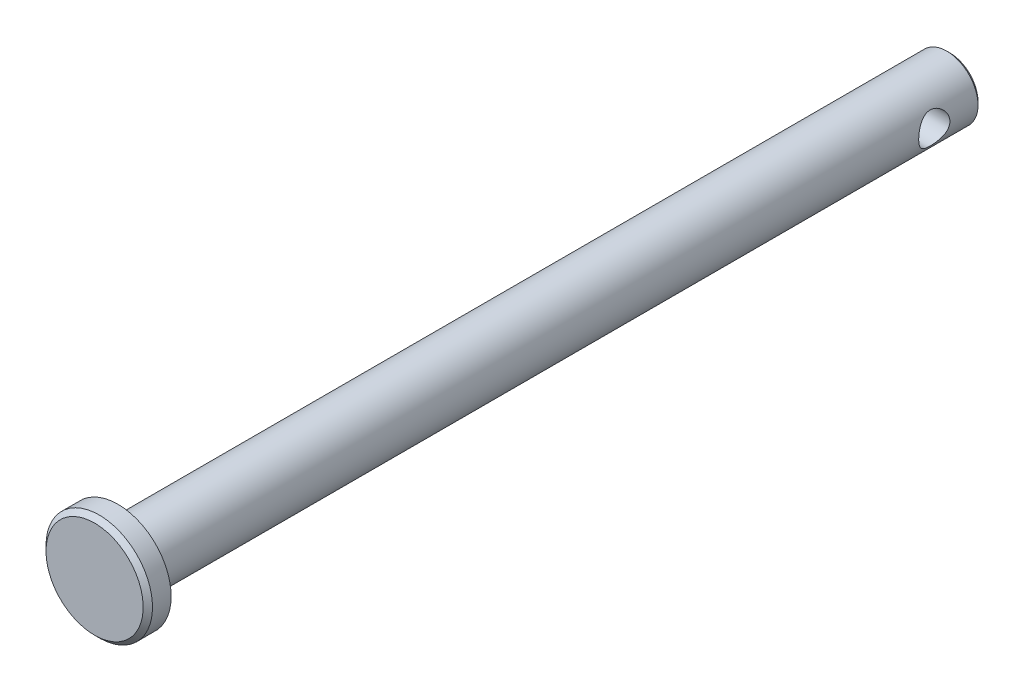
ISO-10303-21;
HEADER;
FILE_DESCRIPTION(('STEP AP214'),'2;1');
FILE_NAME('part.step','',(''),(''),'','','');
FILE_SCHEMA(('AUTOMOTIVE_DESIGN { 1 0 10303 214 1 1 1 1 }'));
ENDSEC;
DATA;
#1=APPLICATION_CONTEXT('core data for automotive mechanical design processes');
#2=APPLICATION_PROTOCOL_DEFINITION('international standard','automotive_design',2000,#1);
#3=PRODUCT_CONTEXT('',#1,'mechanical');
#4=PRODUCT('Part','Part','',(#3));
#5=PRODUCT_RELATED_PRODUCT_CATEGORY('part','',(#4));
#6=PRODUCT_DEFINITION_FORMATION('','',#4);
#7=PRODUCT_DEFINITION_CONTEXT('part definition',#1,'design');
#8=PRODUCT_DEFINITION('design','',#6,#7);
#9=PRODUCT_DEFINITION_SHAPE('','',#8);
#10=(LENGTH_UNIT() NAMED_UNIT(*) SI_UNIT(.MILLI.,.METRE.));
#11=(NAMED_UNIT(*) PLANE_ANGLE_UNIT() SI_UNIT($,.RADIAN.));
#12=(NAMED_UNIT(*) SI_UNIT($,.STERADIAN.) SOLID_ANGLE_UNIT());
#13=UNCERTAINTY_MEASURE_WITH_UNIT(LENGTH_MEASURE(1.E-05),#10,'distance_accuracy_value','');
#14=(GEOMETRIC_REPRESENTATION_CONTEXT(3) GLOBAL_UNCERTAINTY_ASSIGNED_CONTEXT((#13)) GLOBAL_UNIT_ASSIGNED_CONTEXT((#10,
#11,#12)) REPRESENTATION_CONTEXT('',''));
#15=CARTESIAN_POINT('',(0.,0.,0.));
#16=DIRECTION('',(0.,0.,1.));
#17=DIRECTION('',(1.,0.,0.));
#18=AXIS2_PLACEMENT_3D('',#15,#16,#17);
#19=CARTESIAN_POINT('',(0.,0.,31.75));
#20=DIRECTION('',(0.,0.,-1.));
#21=DIRECTION('',(-1.,0.,0.));
#22=AXIS2_PLACEMENT_3D('',#19,#20,#21);
#23=CYLINDRICAL_SURFACE('',#22,2.38125);
#24=CARTESIAN_POINT('',(0.,0.,-31.511875));
#25=DIRECTION('',(0.,0.,1.));
#26=DIRECTION('',(1.,0.,0.));
#27=AXIS2_PLACEMENT_3D('',#24,#25,#26);
#28=CIRCLE('',#27,2.38125);
#29=CARTESIAN_POINT('',(2.38125,0.,-31.511875));
#30=VERTEX_POINT('',#29);
#31=EDGE_CURVE('E37',#30,#30,#28,.T.);
#32=ORIENTED_EDGE('',*,*,#31,.T.);
#33=EDGE_LOOP('',(#32));
#34=FACE_BOUND('',#33,.T.);
#35=CARTESIAN_POINT('',(-2.38125,0.,-26.9875));
#36=CARTESIAN_POINT('',(-2.38124658771817,-0.0625934933908996,-26.9875039318241));
#37=CARTESIAN_POINT('',(-2.37875553370113,-0.12526160776547,-26.9924649933105));
#38=CARTESIAN_POINT('',(-2.36903604532025,-0.248745655116469,-27.0120898356559));
#39=CARTESIAN_POINT('',(-2.36179861446384,-0.309557840743266,-27.0267720429128));
#40=CARTESIAN_POINT('',(-2.34334382664568,-0.427355251873435,-27.0651213783844));
#41=CARTESIAN_POINT('',(-2.33214194770735,-0.484354349749462,-27.0887535887453));
#42=CARTESIAN_POINT('',(-2.30678565164099,-0.593493959385317,-27.1441512710626));
#43=CARTESIAN_POINT('',(-2.29263146732422,-0.645634853781904,-27.1759161017463));
#44=CARTESIAN_POINT('',(-2.26166669988499,-0.747126495522786,-27.2488627251684));
#45=CARTESIAN_POINT('',(-2.24474721461222,-0.796117610742266,-27.2904979643447));
#46=CARTESIAN_POINT('',(-2.2105140207503,-0.886753026544746,-27.3810271362285));
#47=CARTESIAN_POINT('',(-2.19320002298882,-0.928391728636495,-27.4299265485166));
#48=CARTESIAN_POINT('',(-2.15859063769341,-1.00637816303611,-27.5381442380263));
#49=CARTESIAN_POINT('',(-2.14140081986313,-1.04206516514117,-27.5979764170931));
#50=CARTESIAN_POINT('',(-2.11081118475794,-1.10271904514174,-27.7237436094086));
#51=CARTESIAN_POINT('',(-2.09740866244572,-1.12769358094429,-27.7896742220105));
#52=CARTESIAN_POINT('',(-2.07713897941891,-1.16458893898079,-27.921741891143));
#53=CARTESIAN_POINT('',(-2.06992860854359,-1.1772017235864,-27.9876303007427));
#54=CARTESIAN_POINT('',(-2.06194687719966,-1.19113338890835,-28.1209498037312));
#55=CARTESIAN_POINT('',(-2.06116915374352,-1.19246343021919,-28.1883793064747));
#56=CARTESIAN_POINT('',(-2.06586451337536,-1.18429955128952,-28.3141967977005));
#57=CARTESIAN_POINT('',(-2.07060121735085,-1.17608099119853,-28.3727017371749));
#58=CARTESIAN_POINT('',(-2.0845013483624,-1.15126275778341,-28.4873563983473));
#59=CARTESIAN_POINT('',(-2.09366618546584,-1.13466041470314,-28.5435053636291));
#60=CARTESIAN_POINT('',(-2.1155915160392,-1.09324351977209,-28.653457185961));
#61=CARTESIAN_POINT('',(-2.12843079040573,-1.06824668928498,-28.7071749310543));
#62=CARTESIAN_POINT('',(-2.15626240722546,-1.01089025937972,-28.809911454615));
#63=CARTESIAN_POINT('',(-2.17125571566414,-0.978527352789222,-28.8589281083239));
#64=CARTESIAN_POINT('',(-2.204003536286,-0.902572396630542,-28.9574143665474));
#65=CARTESIAN_POINT('',(-2.22186710625626,-0.858076839495928,-29.0061533401016));
#66=CARTESIAN_POINT('',(-2.25680138992047,-0.76147086093895,-29.0957818577598));
#67=CARTESIAN_POINT('',(-2.27387172175947,-0.709356821108761,-29.1366676505153));
#68=CARTESIAN_POINT('',(-2.30626428608779,-0.595927464756047,-29.2112132401635));
#69=CARTESIAN_POINT('',(-2.3214685301789,-0.534297244998049,-29.2444493125057));
#70=CARTESIAN_POINT('',(-2.34741102209979,-0.405367587816351,-29.2998092752043));
#71=CARTESIAN_POINT('',(-2.35815281492167,-0.338072701740846,-29.3219419890337));
#72=CARTESIAN_POINT('',(-2.37320534860897,-0.205700104133524,-29.3526472775502));
#73=CARTESIAN_POINT('',(-2.37797504664999,-0.1409003848091,-29.362191127561));
#74=CARTESIAN_POINT('',(-2.38211931649743,-0.0104532111897005,-29.370493945507));
#75=CARTESIAN_POINT('',(-2.38149644415063,0.0551938267826002,-29.3692580225895));
#76=CARTESIAN_POINT('',(-2.37519200776753,0.180061757270823,-29.3565976616014));
#77=CARTESIAN_POINT('',(-2.36990626897501,0.239386357709476,-29.3459703282183));
#78=CARTESIAN_POINT('',(-2.35532022721706,0.35529070614697,-29.3160790456499));
#79=CARTESIAN_POINT('',(-2.34601948166815,0.411870150775843,-29.2968141443165));
#80=CARTESIAN_POINT('',(-2.323912493394,0.522551749435383,-29.249689325903));
#81=CARTESIAN_POINT('',(-2.31101362357334,0.576536816435452,-29.2215994059547));
#82=CARTESIAN_POINT('',(-2.28295169421308,0.679205558772778,-29.1578813403714));
#83=CARTESIAN_POINT('',(-2.26778767095513,0.727886962326196,-29.1222499834997));
#84=CARTESIAN_POINT('',(-2.23490101029919,0.823635905061685,-29.040422743588));
#85=CARTESIAN_POINT('',(-2.21707334772675,0.870075505159961,-28.9935330222475));
#86=CARTESIAN_POINT('',(-2.18196785003363,0.954710182325452,-28.89258911677));
#87=CARTESIAN_POINT('',(-2.1646904022613,0.992899556088159,-28.8385300179093));
#88=CARTESIAN_POINT('',(-2.13182825744162,1.06168973569882,-28.7214742742178));
#89=CARTESIAN_POINT('',(-2.11636605630571,1.09183348103051,-28.6581715861704));
#90=CARTESIAN_POINT('',(-2.090428799133,1.14071736472269,-28.5263708256536));
#91=CARTESIAN_POINT('',(-2.07994732092736,1.15947219672864,-28.4578795762595));
#92=CARTESIAN_POINT('',(-2.06646662138444,1.18331657161978,-28.3246787659056));
#93=CARTESIAN_POINT('',(-2.06284572182647,1.18954509883978,-28.2602373420111));
#94=CARTESIAN_POINT('',(-2.06175000375602,1.19144552443463,-28.1311583356499));
#95=CARTESIAN_POINT('',(-2.06427252119055,1.18712199863718,-28.0665208503446));
#96=CARTESIAN_POINT('',(-2.0745195450331,1.16910579328329,-27.9453774559884));
#97=CARTESIAN_POINT('',(-2.081725593681,1.1563448992644,-27.8886835027343));
#98=CARTESIAN_POINT('',(-2.09991741148739,1.12296816088622,-27.77830345781));
#99=CARTESIAN_POINT('',(-2.11090439637645,1.10234978978715,-27.7246183400717));
#100=CARTESIAN_POINT('',(-2.13632093965266,1.05229312174863,-27.6177872867941));
#101=CARTESIAN_POINT('',(-2.15093219477964,1.02235532346272,-27.564919904384));
#102=CARTESIAN_POINT('',(-2.18164566727434,0.955061000604872,-27.46461375536));
#103=CARTESIAN_POINT('',(-2.19774865799103,0.91770061638102,-27.4171778333514));
#104=CARTESIAN_POINT('',(-2.23197328511557,0.831298335810093,-27.3230872022555));
#105=CARTESIAN_POINT('',(-2.25010245755217,0.78138864114649,-27.2772277562503));
#106=CARTESIAN_POINT('',(-2.28454448778714,0.674078066156025,-27.1943556353612));
#107=CARTESIAN_POINT('',(-2.30085636405197,0.616673173627614,-27.1573477289956));
#108=CARTESIAN_POINT('',(-2.33002942662263,0.495218557463753,-27.0931842055862));
#109=CARTESIAN_POINT('',(-2.34286539970213,0.431124721872154,-27.0661000982945));
#110=CARTESIAN_POINT('',(-2.36340659560876,0.298539814353401,-27.0234471500715));
#111=CARTESIAN_POINT('',(-2.37112639390897,0.230061848926336,-27.0078455823685));
#112=CARTESIAN_POINT('',(-2.37762409336193,0.134066692531782,-26.9947658949378));
#113=CARTESIAN_POINT('',(-2.37898025606987,0.107348987707656,-26.9920450432217));
#114=CARTESIAN_POINT('',(-2.3807939546427,0.0537587806828983,-26.988411226369));
#115=CARTESIAN_POINT('',(-2.38125146570418,0.0268862742301641,-26.9874983111327));
#116=CARTESIAN_POINT('',(-2.38125,0.,-26.9875));
#117=B_SPLINE_CURVE_WITH_KNOTS('',3,(#35,#36,#37,#38,#39,#40,#41,#42,#43,#44,#45,#46,#47,#48,
#49,#50,#51,#52,#53,#54,#55,#56,#57,#58,#59,#60,#61,#62,#63,#64,#65,#66,#67,#68,#69,#70,#71,#72,
#73,#74,#75,#76,#77,#78,#79,#80,#81,#82,#83,#84,#85,#86,#87,#88,#89,#90,#91,#92,#93,#94,#95,#96,
#97,#98,#99,#100,#101,#102,#103,#104,#105,#106,#107,#108,#109,#110,#111,#112,#113,#114,#115,
#116),.UNSPECIFIED.,.T.,.F.,(4,2,2,2,2,2,2,2,2,2,2,2,2,2,2,2,2,2,2,2,2,2,2,2,2,2,2,2,2,2,2,2,2,
2,2,2,2,2,2,2,4),(0.,0.187671381491036,0.375699515747514,0.563001503883019,0.75028872744243,
0.948906406473726,1.14767467670684,1.36185743031615,1.57588681716391,1.77710320704461,
1.97812053569865,2.15509926337348,2.33213438424011,2.51329317200606,2.69453345625452,
2.8987544577565,3.10307277131562,3.31687910824069,3.53051527011184,3.72645730217447,
3.92230647121477,4.10297598058852,4.28366541066829,4.46952119208218,4.65545627297242,
4.85965036423512,5.0639851644525,5.27821543446363,5.4921687202949,5.68558331740252,
5.8789140564582,6.05382723196982,6.22879670208068,6.41552156348467,6.60234377481073,
6.81186617152195,7.02150118957733,7.23261841267422,7.44313156831559,7.52374130413948,
7.60435326481741),.UNSPECIFIED.);
#118=CARTESIAN_POINT('',(-2.38125,0.,-26.9875));
#119=VERTEX_POINT('',#118);
#120=EDGE_CURVE('E48',#119,#119,#117,.T.);
#121=ORIENTED_EDGE('',*,*,#120,.T.);
#122=EDGE_LOOP('',(#121));
#123=FACE_BOUND('',#122,.T.);
#124=CARTESIAN_POINT('',(2.38125,0.,-29.36875));
#125=CARTESIAN_POINT('',(2.38124658771817,-0.0625934933908996,-29.3687460681758));
#126=CARTESIAN_POINT('',(2.37875553370113,-0.12526160776547,-29.3637850066895));
#127=CARTESIAN_POINT('',(2.36903604532025,-0.248745655116469,-29.3441601643441));
#128=CARTESIAN_POINT('',(2.36179861446384,-0.309557840743266,-29.3294779570872));
#129=CARTESIAN_POINT('',(2.34334382664568,-0.427355251873434,-29.2911286216156));
#130=CARTESIAN_POINT('',(2.33214194770735,-0.484354349749461,-29.2674964112547));
#131=CARTESIAN_POINT('',(2.30678565164099,-0.593493959385316,-29.2120987289374));
#132=CARTESIAN_POINT('',(2.29263146732422,-0.645634853781903,-29.1803338982537));
#133=CARTESIAN_POINT('',(2.26166669988499,-0.747126495522786,-29.1073872748316));
#134=CARTESIAN_POINT('',(2.24474721461222,-0.796117610742266,-29.0657520356553));
#135=CARTESIAN_POINT('',(2.2105140207503,-0.886753026544746,-28.9752228637715));
#136=CARTESIAN_POINT('',(2.19320002298882,-0.928391728636495,-28.9263234514834));
#137=CARTESIAN_POINT('',(2.15859063769341,-1.00637816303611,-28.8181057619737));
#138=CARTESIAN_POINT('',(2.14140081986313,-1.04206516514117,-28.7582735829069));
#139=CARTESIAN_POINT('',(2.11081118475794,-1.10271904514174,-28.6325063905914));
#140=CARTESIAN_POINT('',(2.09740866244572,-1.12769358094429,-28.5665757779895));
#141=CARTESIAN_POINT('',(2.07713897941891,-1.16458893898079,-28.434508108857));
#142=CARTESIAN_POINT('',(2.06992860854359,-1.1772017235864,-28.3686196992573));
#143=CARTESIAN_POINT('',(2.06194687719966,-1.19113338890835,-28.2353001962688));
#144=CARTESIAN_POINT('',(2.06116915374352,-1.19246343021919,-28.1678706935253));
#145=CARTESIAN_POINT('',(2.06586451337536,-1.18429955128952,-28.0420532022995));
#146=CARTESIAN_POINT('',(2.07060121735085,-1.17608099119853,-27.9835482628251));
#147=CARTESIAN_POINT('',(2.0845013483624,-1.15126275778341,-27.8688936016527));
#148=CARTESIAN_POINT('',(2.09366618546583,-1.13466041470314,-27.8127446363709));
#149=CARTESIAN_POINT('',(2.1155915160392,-1.09324351977209,-27.702792814039));
#150=CARTESIAN_POINT('',(2.12843079040573,-1.06824668928498,-27.6490750689457));
#151=CARTESIAN_POINT('',(2.15626240722546,-1.01089025937972,-27.546338545385));
#152=CARTESIAN_POINT('',(2.17125571566414,-0.978527352789223,-27.4973218916761));
#153=CARTESIAN_POINT('',(2.204003536286,-0.902572396630542,-27.3988356334526));
#154=CARTESIAN_POINT('',(2.22186710625626,-0.858076839495928,-27.3500966598984));
#155=CARTESIAN_POINT('',(2.25680138992047,-0.76147086093895,-27.2604681422402));
#156=CARTESIAN_POINT('',(2.27387172175947,-0.709356821108761,-27.2195823494847));
#157=CARTESIAN_POINT('',(2.30626428608779,-0.595927464756047,-27.1450367598365));
#158=CARTESIAN_POINT('',(2.3214685301789,-0.534297244998049,-27.1118006874943));
#159=CARTESIAN_POINT('',(2.34741102209979,-0.405367587816351,-27.0564407247957));
#160=CARTESIAN_POINT('',(2.35815281492167,-0.338072701740846,-27.0343080109663));
#161=CARTESIAN_POINT('',(2.37320534860897,-0.205700104133524,-27.0036027224498));
#162=CARTESIAN_POINT('',(2.37797504664999,-0.1409003848091,-26.994058872439));
#163=CARTESIAN_POINT('',(2.38211931649743,-0.0104532111897004,-26.985756054493));
#164=CARTESIAN_POINT('',(2.38149644415063,0.0551938267826003,-26.9869919774105));
#165=CARTESIAN_POINT('',(2.37519200776753,0.180061757270823,-26.9996523383986));
#166=CARTESIAN_POINT('',(2.36990626897501,0.239386357709476,-27.0102796717817));
#167=CARTESIAN_POINT('',(2.35532022721706,0.35529070614697,-27.0401709543501));
#168=CARTESIAN_POINT('',(2.34601948166815,0.411870150775843,-27.0594358556835));
#169=CARTESIAN_POINT('',(2.323912493394,0.522551749435382,-27.106560674097));
#170=CARTESIAN_POINT('',(2.31101362357334,0.57653681643545,-27.1346505940453));
#171=CARTESIAN_POINT('',(2.28295169421308,0.679205558772777,-27.1983686596286));
#172=CARTESIAN_POINT('',(2.26778767095513,0.727886962326195,-27.2340000165003));
#173=CARTESIAN_POINT('',(2.23490101029919,0.823635905061684,-27.3158272564119));
#174=CARTESIAN_POINT('',(2.21707334772675,0.87007550515996,-27.3627169777525));
#175=CARTESIAN_POINT('',(2.18196785003363,0.954710182325451,-27.46366088323));
#176=CARTESIAN_POINT('',(2.1646904022613,0.992899556088159,-27.5177199820907));
#177=CARTESIAN_POINT('',(2.13182825744162,1.06168973569882,-27.6347757257822));
#178=CARTESIAN_POINT('',(2.11636605630571,1.0918334810305,-27.6980784138296));
#179=CARTESIAN_POINT('',(2.090428799133,1.14071736472269,-27.8298791743464));
#180=CARTESIAN_POINT('',(2.07994732092736,1.15947219672864,-27.8983704237405));
#181=CARTESIAN_POINT('',(2.06646662138444,1.18331657161978,-28.0315712340944));
#182=CARTESIAN_POINT('',(2.06284572182647,1.18954509883978,-28.0960126579889));
#183=CARTESIAN_POINT('',(2.06175000375602,1.19144552443463,-28.2250916643501));
#184=CARTESIAN_POINT('',(2.06427252119055,1.18712199863718,-28.2897291496554));
#185=CARTESIAN_POINT('',(2.0745195450331,1.16910579328329,-28.4108725440115));
#186=CARTESIAN_POINT('',(2.081725593681,1.1563448992644,-28.4675664972657));
#187=CARTESIAN_POINT('',(2.09991741148739,1.12296816088622,-28.57794654219));
#188=CARTESIAN_POINT('',(2.11090439637645,1.10234978978715,-28.6316316599282));
#189=CARTESIAN_POINT('',(2.13632093965266,1.05229312174863,-28.7384627132059));
#190=CARTESIAN_POINT('',(2.15093219477964,1.02235532346272,-28.791330095616));
#191=CARTESIAN_POINT('',(2.18164566727434,0.955061000604872,-28.89163624464));
#192=CARTESIAN_POINT('',(2.19774865799103,0.91770061638102,-28.9390721666486));
#193=CARTESIAN_POINT('',(2.23197328511557,0.831298335810093,-29.0331627977445));
#194=CARTESIAN_POINT('',(2.25010245755217,0.78138864114649,-29.0790222437497));
#195=CARTESIAN_POINT('',(2.28454448778714,0.674078066156025,-29.1618943646388));
#196=CARTESIAN_POINT('',(2.30085636405197,0.616673173627614,-29.1989022710044));
#197=CARTESIAN_POINT('',(2.33002942662263,0.495218557463753,-29.2630657944137));
#198=CARTESIAN_POINT('',(2.34286539970213,0.431124721872154,-29.2901499017055));
#199=CARTESIAN_POINT('',(2.36340659560876,0.298539814353401,-29.3328028499285));
#200=CARTESIAN_POINT('',(2.37112639390897,0.230061848926336,-29.3484044176315));
#201=CARTESIAN_POINT('',(2.37762409336193,0.134066692531782,-29.3614841050622));
#202=CARTESIAN_POINT('',(2.37898025606987,0.107348987707656,-29.3642049567782));
#203=CARTESIAN_POINT('',(2.3807939546427,0.0537587806828983,-29.3678387736309));
#204=CARTESIAN_POINT('',(2.38125146570418,0.0268862742301641,-29.3687516888673));
#205=CARTESIAN_POINT('',(2.38125,0.,-29.36875));
#206=B_SPLINE_CURVE_WITH_KNOTS('',3,(#124,#125,#126,#127,#128,#129,#130,#131,#132,#133,#134,
#135,#136,#137,#138,#139,#140,#141,#142,#143,#144,#145,#146,#147,#148,#149,#150,#151,#152,#153,
#154,#155,#156,#157,#158,#159,#160,#161,#162,#163,#164,#165,#166,#167,#168,#169,#170,#171,#172,
#173,#174,#175,#176,#177,#178,#179,#180,#181,#182,#183,#184,#185,#186,#187,#188,#189,#190,#191,
#192,#193,#194,#195,#196,#197,#198,#199,#200,#201,#202,#203,#204,#205),.UNSPECIFIED.,.T.,.F.,(4,
2,2,2,2,2,2,2,2,2,2,2,2,2,2,2,2,2,2,2,2,2,2,2,2,2,2,2,2,2,2,2,2,2,2,2,2,2,2,2,4),(0.,
0.187671381491036,0.375699515747514,0.563001503883017,0.750288727442429,0.948906406473726,
1.14767467670684,1.36185743031615,1.57588681716391,1.77710320704461,1.97812053569865,
2.15509926337347,2.33213438424011,2.51329317200606,2.69453345625452,2.8987544577565,
3.10307277131562,3.31687910824069,3.53051527011184,3.72645730217447,3.92230647121477,
4.10297598058852,4.28366541066829,4.46952119208218,4.65545627297242,4.85965036423512,
5.0639851644525,5.27821543446363,5.4921687202949,5.68558331740252,5.8789140564582,
6.05382723196982,6.22879670208068,6.41552156348467,6.60234377481073,6.81186617152195,
7.02150118957733,7.23261841267422,7.44313156831559,7.52374130413948,7.60435326481741),.UNSPECIFIED.);
#207=CARTESIAN_POINT('',(2.38125,0.,-29.36875));
#208=VERTEX_POINT('',#207);
#209=EDGE_CURVE('E56',#208,#208,#206,.T.);
#210=ORIENTED_EDGE('',*,*,#209,.T.);
#211=EDGE_LOOP('',(#210));
#212=FACE_BOUND('',#211,.T.);
#213=CARTESIAN_POINT('',(0.,0.,31.75));
#214=DIRECTION('',(0.,0.,1.));
#215=DIRECTION('',(1.,0.,0.));
#216=AXIS2_PLACEMENT_3D('',#213,#214,#215);
#217=CIRCLE('',#216,2.38125);
#218=CARTESIAN_POINT('',(2.38125,0.,31.75));
#219=VERTEX_POINT('',#218);
#220=EDGE_CURVE('E94',#219,#219,#217,.T.);
#221=ORIENTED_EDGE('',*,*,#220,.F.);
#222=EDGE_LOOP('',(#221));
#223=FACE_BOUND('',#222,.T.);
#224=ADVANCED_FACE('F30',(#34,#123,#212,#223),#23,.T.);
#225=CARTESIAN_POINT('',(0.,0.,-31.75));
#226=DIRECTION('',(0.,0.,1.));
#227=DIRECTION('',(1.,0.,0.));
#228=AXIS2_PLACEMENT_3D('',#225,#226,#227);
#229=PLANE('',#228);
#230=CARTESIAN_POINT('',(0.,0.,-31.75));
#231=DIRECTION('',(0.,0.,1.));
#232=DIRECTION('',(1.,0.,0.));
#233=AXIS2_PLACEMENT_3D('',#230,#231,#232);
#234=CIRCLE('',#233,2.143125);
#235=CARTESIAN_POINT('',(2.14312499999999,0.,-31.75));
#236=VERTEX_POINT('',#235);
#237=EDGE_CURVE('E10',#236,#236,#234,.F.);
#238=ORIENTED_EDGE('',*,*,#237,.T.);
#239=EDGE_LOOP('',(#238));
#240=FACE_BOUND('',#239,.T.);
#241=ADVANCED_FACE('F76',(#240),#229,.F.);
#242=CARTESIAN_POINT('',(0.,0.,31.75));
#243=DIRECTION('',(0.,0.,1.));
#244=DIRECTION('',(1.,0.,0.));
#245=AXIS2_PLACEMENT_3D('',#242,#243,#244);
#246=PLANE('',#245);
#247=CARTESIAN_POINT('',(0.,0.,31.75));
#248=DIRECTION('',(0.,0.,1.));
#249=DIRECTION('',(1.,0.,0.));
#250=AXIS2_PLACEMENT_3D('',#247,#248,#249);
#251=CIRCLE('',#250,4.064);
#252=CARTESIAN_POINT('',(4.064,0.,31.75));
#253=VERTEX_POINT('',#252);
#254=EDGE_CURVE('E55',#253,#253,#251,.T.);
#255=ORIENTED_EDGE('',*,*,#254,.F.);
#256=EDGE_LOOP('',(#255));
#257=FACE_BOUND('',#256,.T.);
#258=ORIENTED_EDGE('',*,*,#220,.T.);
#259=EDGE_LOOP('',(#258));
#260=FACE_BOUND('',#259,.T.);
#261=ADVANCED_FACE('F73',(#257,#260),#246,.F.);
#262=CARTESIAN_POINT('',(0.,0.,33.528));
#263=DIRECTION('',(0.,0.,-1.));
#264=DIRECTION('',(-1.,0.,0.));
#265=AXIS2_PLACEMENT_3D('',#262,#263,#264);
#266=CYLINDRICAL_SURFACE('',#265,4.064);
#267=CARTESIAN_POINT('',(0.,0.,33.1724));
#268=DIRECTION('',(0.,0.,1.));
#269=DIRECTION('',(1.,0.,0.));
#270=AXIS2_PLACEMENT_3D('',#267,#268,#269);
#271=CIRCLE('',#270,4.064);
#272=CARTESIAN_POINT('',(-4.064,0.,33.1724));
#273=VERTEX_POINT('',#272);
#274=EDGE_CURVE('E41',#273,#273,#271,.F.);
#275=ORIENTED_EDGE('',*,*,#274,.T.);
#276=EDGE_LOOP('',(#275));
#277=FACE_BOUND('',#276,.T.);
#278=ORIENTED_EDGE('',*,*,#254,.T.);
#279=EDGE_LOOP('',(#278));
#280=FACE_BOUND('',#279,.T.);
#281=ADVANCED_FACE('F71',(#277,#280),#266,.T.);
#282=CARTESIAN_POINT('',(0.,0.,33.528));
#283=DIRECTION('',(0.,0.,1.));
#284=DIRECTION('',(1.,0.,0.));
#285=AXIS2_PLACEMENT_3D('',#282,#283,#284);
#286=PLANE('',#285);
#287=CARTESIAN_POINT('',(0.,0.,33.528));
#288=DIRECTION('',(0.,0.,1.));
#289=DIRECTION('',(1.,0.,0.));
#290=AXIS2_PLACEMENT_3D('',#287,#288,#289);
#291=CIRCLE('',#290,3.70840000000001);
#292=CARTESIAN_POINT('',(-3.70840000000002,0.,33.528));
#293=VERTEX_POINT('',#292);
#294=EDGE_CURVE('E45',#293,#293,#291,.T.);
#295=ORIENTED_EDGE('',*,*,#294,.T.);
#296=EDGE_LOOP('',(#295));
#297=FACE_BOUND('',#296,.T.);
#298=ADVANCED_FACE('F67',(#297),#286,.T.);
#299=CARTESIAN_POINT('',(0.,0.,33.528));
#300=DIRECTION('',(0.,0.,-1.));
#301=DIRECTION('',(-1.,0.,0.));
#302=AXIS2_PLACEMENT_3D('',#299,#300,#301);
#303=CONICAL_SURFACE('',#302,3.70840000000001,0.785398163397451);
#304=CARTESIAN_POINT('',(-4.064,0.,33.1724));
#305=CARTESIAN_POINT('',(-4.06029583333334,0.,33.1761041666667));
#306=CARTESIAN_POINT('',(-4.05659166666667,0.,33.1798083333333));
#307=CARTESIAN_POINT('',(-4.04918333333334,0.,33.1872166666667));
#308=CARTESIAN_POINT('',(-4.04547916666667,0.,33.1909208333333));
#309=CARTESIAN_POINT('',(-4.03807083333334,0.,33.1983291666667));
#310=CARTESIAN_POINT('',(-4.03436666666667,0.,33.2020333333333));
#311=CARTESIAN_POINT('',(-4.02695833333334,0.,33.2094416666667));
#312=CARTESIAN_POINT('',(-4.02325416666667,0.,33.2131458333333));
#313=CARTESIAN_POINT('',(-4.01584583333334,0.,33.2205541666667));
#314=CARTESIAN_POINT('',(-4.01214166666667,0.,33.2242583333333));
#315=CARTESIAN_POINT('',(-4.00473333333334,0.,33.2316666666667));
#316=CARTESIAN_POINT('',(-4.00102916666667,0.,33.2353708333333));
#317=CARTESIAN_POINT('',(-3.99362083333334,0.,33.2427791666667));
#318=CARTESIAN_POINT('',(-3.98991666666667,0.,33.2464833333333));
#319=CARTESIAN_POINT('',(-3.98250833333334,0.,33.2538916666667));
#320=CARTESIAN_POINT('',(-3.97880416666667,0.,33.2575958333333));
#321=CARTESIAN_POINT('',(-3.97139583333334,0.,33.2650041666667));
#322=CARTESIAN_POINT('',(-3.96769166666667,0.,33.2687083333333));
#323=CARTESIAN_POINT('',(-3.96028333333334,0.,33.2761166666667));
#324=CARTESIAN_POINT('',(-3.95657916666668,0.,33.2798208333333));
#325=CARTESIAN_POINT('',(-3.94917083333334,0.,33.2872291666667));
#326=CARTESIAN_POINT('',(-3.94546666666667,0.,33.2909333333333));
#327=CARTESIAN_POINT('',(-3.93805833333334,0.,33.2983416666667));
#328=CARTESIAN_POINT('',(-3.93435416666668,0.,33.3020458333333));
#329=CARTESIAN_POINT('',(-3.92694583333334,0.,33.3094541666667));
#330=CARTESIAN_POINT('',(-3.92324166666668,0.,33.3131583333333));
#331=CARTESIAN_POINT('',(-3.91583333333334,0.,33.3205666666667));
#332=CARTESIAN_POINT('',(-3.91212916666668,0.,33.3242708333333));
#333=CARTESIAN_POINT('',(-3.90472083333334,0.,33.3316791666667));
#334=CARTESIAN_POINT('',(-3.90101666666668,0.,33.3353833333333));
#335=CARTESIAN_POINT('',(-3.89360833333334,0.,33.3427916666667));
#336=CARTESIAN_POINT('',(-3.88990416666668,0.,33.3464958333333));
#337=CARTESIAN_POINT('',(-3.88249583333334,0.,33.3539041666667));
#338=CARTESIAN_POINT('',(-3.87879166666668,0.,33.3576083333333));
#339=CARTESIAN_POINT('',(-3.87138333333334,0.,33.3650166666667));
#340=CARTESIAN_POINT('',(-3.86767916666668,0.,33.3687208333333));
#341=CARTESIAN_POINT('',(-3.86027083333335,0.,33.3761291666667));
#342=CARTESIAN_POINT('',(-3.85656666666668,0.,33.3798333333333));
#343=CARTESIAN_POINT('',(-3.84915833333335,0.,33.3872416666667));
#344=CARTESIAN_POINT('',(-3.84545416666668,0.,33.3909458333333));
#345=CARTESIAN_POINT('',(-3.83804583333335,0.,33.3983541666667));
#346=CARTESIAN_POINT('',(-3.83434166666668,0.,33.4020583333333));
#347=CARTESIAN_POINT('',(-3.82693333333335,0.,33.4094666666667));
#348=CARTESIAN_POINT('',(-3.82322916666668,0.,33.4131708333333));
#349=CARTESIAN_POINT('',(-3.81582083333335,0.,33.4205791666667));
#350=CARTESIAN_POINT('',(-3.81211666666668,0.,33.4242833333333));
#351=CARTESIAN_POINT('',(-3.80470833333335,0.,33.4316916666667));
#352=CARTESIAN_POINT('',(-3.80100416666668,0.,33.4353958333333));
#353=CARTESIAN_POINT('',(-3.79359583333335,0.,33.4428041666667));
#354=CARTESIAN_POINT('',(-3.78989166666668,0.,33.4465083333333));
#355=CARTESIAN_POINT('',(-3.78248333333335,0.,33.4539166666667));
#356=CARTESIAN_POINT('',(-3.77877916666668,0.,33.4576208333333));
#357=CARTESIAN_POINT('',(-3.77137083333335,0.,33.4650291666667));
#358=CARTESIAN_POINT('',(-3.76766666666668,0.,33.4687333333333));
#359=CARTESIAN_POINT('',(-3.76025833333335,0.,33.4761416666667));
#360=CARTESIAN_POINT('',(-3.75655416666668,0.,33.4798458333333));
#361=CARTESIAN_POINT('',(-3.74914583333335,0.,33.4872541666667));
#362=CARTESIAN_POINT('',(-3.74544166666668,0.,33.4909583333333));
#363=CARTESIAN_POINT('',(-3.73803333333335,0.,33.4983666666667));
#364=CARTESIAN_POINT('',(-3.73432916666668,0.,33.5020708333333));
#365=CARTESIAN_POINT('',(-3.72692083333335,0.,33.5094791666667));
#366=CARTESIAN_POINT('',(-3.72321666666668,0.,33.5131833333333));
#367=CARTESIAN_POINT('',(-3.71580833333335,0.,33.5205916666667));
#368=CARTESIAN_POINT('',(-3.71210416666668,0.,33.5242958333333));
#369=CARTESIAN_POINT('',(-3.70840000000002,0.,33.528));
#370=B_SPLINE_CURVE_WITH_KNOTS('',3,(#304,#305,#306,#307,#308,#309,#310,#311,#312,#313,#314,
#315,#316,#317,#318,#319,#320,#321,#322,#323,#324,#325,#326,#327,#328,#329,#330,#331,#332,#333,
#334,#335,#336,#337,#338,#339,#340,#341,#342,#343,#344,#345,#346,#347,#348,#349,#350,#351,#352,
#353,#354,#355,#356,#357,#358,#359,#360,#361,#362,#363,#364,#365,#366,#367,#368,#369),
.UNSPECIFIED.,.F.,.F.,(4,2,2,2,2,2,2,2,2,2,2,2,2,2,2,2,2,2,2,2,2,2,2,2,2,2,2,2,2,2,2,2,4),(0.,
0.0157154482118709,0.0314308964237418,0.0471463446356127,0.0628617928474837,0.0785772410593546,
0.0942926892712255,0.110008137483096,0.125723585694962,0.141439033906833,0.157154482118704,
0.172869930330576,0.188585378542447,0.204300826754318,0.220016274966188,0.235731723178059,
0.251447171389925,0.267162619601796,0.282878067813667,0.298593516025538,0.314308964237409,
0.33002441244928,0.345739860661151,0.361455308873022,0.377170757084893,0.392886205296759,
0.40860165350863,0.424317101720501,0.440032549932372,0.455747998144243,0.471463446356114,
0.487178894567985,0.502894342779856),.UNSPECIFIED.);
#371=EDGE_CURVE('BSEAM65',#273,#293,#370,.T.);
#372=ORIENTED_EDGE('',*,*,#274,.F.);
#373=ORIENTED_EDGE('',*,*,#294,.F.);
#374=ORIENTED_EDGE('',*,*,#371,.T.);
#375=ORIENTED_EDGE('',*,*,#371,.F.);
#376=EDGE_LOOP('',(#372,#374,#373,#375));
#377=FACE_BOUND('',#376,.T.);
#378=ADVANCED_FACE('F65',(#377),#303,.T.);
#379=CARTESIAN_POINT('',(-4.064,0.,-28.178125));
#380=DIRECTION('',(1.,0.,0.));
#381=DIRECTION('',(0.,0.,-1.));
#382=AXIS2_PLACEMENT_3D('',#379,#380,#381);
#383=CYLINDRICAL_SURFACE('',#382,1.190625);
#384=ORIENTED_EDGE('',*,*,#209,.F.);
#385=EDGE_LOOP('',(#384));
#386=FACE_BOUND('',#385,.T.);
#387=ORIENTED_EDGE('',*,*,#120,.F.);
#388=EDGE_LOOP('',(#387));
#389=FACE_BOUND('',#388,.T.);
#390=ADVANCED_FACE('F61',(#386,#389),#383,.F.);
#391=CARTESIAN_POINT('',(0.,0.,-31.511875));
#392=DIRECTION('',(0.,0.,1.));
#393=DIRECTION('',(1.,0.,0.));
#394=AXIS2_PLACEMENT_3D('',#391,#392,#393);
#395=CONICAL_SURFACE('',#394,2.38125,0.785398163397446);
#396=CARTESIAN_POINT('',(2.14312499999999,0.,-31.75));
#397=CARTESIAN_POINT('',(2.14560546874999,0.,-31.74751953125));
#398=CARTESIAN_POINT('',(2.14808593749999,0.,-31.7450390625));
#399=CARTESIAN_POINT('',(2.15304687499999,0.,-31.740078125));
#400=CARTESIAN_POINT('',(2.15552734374999,0.,-31.73759765625));
#401=CARTESIAN_POINT('',(2.16048828124999,0.,-31.73263671875));
#402=CARTESIAN_POINT('',(2.16296874999999,0.,-31.73015625));
#403=CARTESIAN_POINT('',(2.16792968749999,0.,-31.7251953125));
#404=CARTESIAN_POINT('',(2.17041015624999,0.,-31.72271484375));
#405=CARTESIAN_POINT('',(2.17537109374999,0.,-31.71775390625));
#406=CARTESIAN_POINT('',(2.17785156249999,0.,-31.7152734375));
#407=CARTESIAN_POINT('',(2.18281249999999,0.,-31.7103125));
#408=CARTESIAN_POINT('',(2.18529296874999,0.,-31.70783203125));
#409=CARTESIAN_POINT('',(2.19025390624999,0.,-31.70287109375));
#410=CARTESIAN_POINT('',(2.19273437499999,0.,-31.700390625));
#411=CARTESIAN_POINT('',(2.19769531249999,0.,-31.6954296875));
#412=CARTESIAN_POINT('',(2.20017578124999,0.,-31.69294921875));
#413=CARTESIAN_POINT('',(2.20513671874999,0.,-31.68798828125));
#414=CARTESIAN_POINT('',(2.20761718749999,0.,-31.6855078125));
#415=CARTESIAN_POINT('',(2.21257812499999,0.,-31.680546875));
#416=CARTESIAN_POINT('',(2.21505859374999,0.,-31.67806640625));
#417=CARTESIAN_POINT('',(2.22001953124999,0.,-31.67310546875));
#418=CARTESIAN_POINT('',(2.22249999999999,0.,-31.670625));
#419=CARTESIAN_POINT('',(2.22746093749999,0.,-31.6656640625));
#420=CARTESIAN_POINT('',(2.22994140624999,0.,-31.66318359375));
#421=CARTESIAN_POINT('',(2.23490234374999,0.,-31.65822265625));
#422=CARTESIAN_POINT('',(2.23738281249999,0.,-31.6557421875));
#423=CARTESIAN_POINT('',(2.24234374999999,0.,-31.65078125));
#424=CARTESIAN_POINT('',(2.24482421874999,0.,-31.64830078125));
#425=CARTESIAN_POINT('',(2.24978515624999,0.,-31.64333984375));
#426=CARTESIAN_POINT('',(2.25226562499999,0.,-31.640859375));
#427=CARTESIAN_POINT('',(2.25722656249999,0.,-31.6358984375));
#428=CARTESIAN_POINT('',(2.25970703124999,0.,-31.63341796875));
#429=CARTESIAN_POINT('',(2.26466796875,0.,-31.62845703125));
#430=CARTESIAN_POINT('',(2.26714843749999,0.,-31.6259765625));
#431=CARTESIAN_POINT('',(2.27210937499999,0.,-31.621015625));
#432=CARTESIAN_POINT('',(2.27458984374999,0.,-31.61853515625));
#433=CARTESIAN_POINT('',(2.27955078124999,0.,-31.61357421875));
#434=CARTESIAN_POINT('',(2.28203124999999,0.,-31.61109375));
#435=CARTESIAN_POINT('',(2.2869921875,0.,-31.6061328125));
#436=CARTESIAN_POINT('',(2.28947265625,0.,-31.60365234375));
#437=CARTESIAN_POINT('',(2.29443359374999,0.,-31.59869140625));
#438=CARTESIAN_POINT('',(2.29691406249999,0.,-31.5962109375));
#439=CARTESIAN_POINT('',(2.301875,0.,-31.59125));
#440=CARTESIAN_POINT('',(2.30435546875,0.,-31.58876953125));
#441=CARTESIAN_POINT('',(2.30931640625,0.,-31.58380859375));
#442=CARTESIAN_POINT('',(2.311796875,0.,-31.581328125));
#443=CARTESIAN_POINT('',(2.3167578125,0.,-31.5763671875));
#444=CARTESIAN_POINT('',(2.31923828124999,0.,-31.57388671875));
#445=CARTESIAN_POINT('',(2.32419921875,0.,-31.56892578125));
#446=CARTESIAN_POINT('',(2.3266796875,0.,-31.5664453125));
#447=CARTESIAN_POINT('',(2.331640625,0.,-31.561484375));
#448=CARTESIAN_POINT('',(2.33412109375,0.,-31.55900390625));
#449=CARTESIAN_POINT('',(2.33908203125,0.,-31.55404296875));
#450=CARTESIAN_POINT('',(2.3415625,0.,-31.5515625));
#451=CARTESIAN_POINT('',(2.3465234375,0.,-31.5466015625));
#452=CARTESIAN_POINT('',(2.34900390625,0.,-31.54412109375));
#453=CARTESIAN_POINT('',(2.35396484375,0.,-31.53916015625));
#454=CARTESIAN_POINT('',(2.3564453125,0.,-31.5366796875));
#455=CARTESIAN_POINT('',(2.36140625,0.,-31.53171875));
#456=CARTESIAN_POINT('',(2.36388671875,0.,-31.52923828125));
#457=CARTESIAN_POINT('',(2.36884765625,0.,-31.52427734375));
#458=CARTESIAN_POINT('',(2.371328125,0.,-31.521796875));
#459=CARTESIAN_POINT('',(2.3762890625,0.,-31.5168359375));
#460=CARTESIAN_POINT('',(2.37876953125,0.,-31.51435546875));
#461=CARTESIAN_POINT('',(2.38125,0.,-31.511875));
#462=B_SPLINE_CURVE_WITH_KNOTS('',3,(#396,#397,#398,#399,#400,#401,#402,#403,#404,#405,#406,
#407,#408,#409,#410,#411,#412,#413,#414,#415,#416,#417,#418,#419,#420,#421,#422,#423,#424,#425,
#426,#427,#428,#429,#430,#431,#432,#433,#434,#435,#436,#437,#438,#439,#440,#441,#442,#443,#444,
#445,#446,#447,#448,#449,#450,#451,#452,#453,#454,#455,#456,#457,#458,#459,#460,#461),
.UNSPECIFIED.,.F.,.F.,(4,2,2,2,2,2,2,2,2,2,2,2,2,2,2,2,2,2,2,2,2,2,2,2,2,2,2,2,2,2,2,2,4),(0.,
0.01052373764188,0.02104747528376,0.0315712129256351,0.0420949505675151,0.0526186882093948,
0.0631424258512699,0.0736661634931499,0.084189901135025,0.094713638776905,0.105237376418785,
0.11576111406066,0.12628485170254,0.13680858934442,0.147332326986295,0.157856064628175,
0.16837980227005,0.17890353991193,0.18942727755381,0.199951015195685,0.210474752837565,
0.220998490479445,0.23152222812132,0.2420459657632,0.25256970340508,0.263093441046955,
0.273617178688835,0.28414091633071,0.29466465397259,0.30518839161447,0.315712129256345,
0.326235866898225,0.336759604540105),.UNSPECIFIED.);
#463=EDGE_CURVE('BSEAM32',#236,#30,#462,.T.);
#464=ORIENTED_EDGE('',*,*,#237,.F.);
#465=ORIENTED_EDGE('',*,*,#31,.F.);
#466=ORIENTED_EDGE('',*,*,#463,.T.);
#467=ORIENTED_EDGE('',*,*,#463,.F.);
#468=EDGE_LOOP('',(#464,#466,#465,#467));
#469=FACE_BOUND('',#468,.T.);
#470=ADVANCED_FACE('F32',(#469),#395,.T.);
#471=CLOSED_SHELL('',(#224,#241,#261,#281,#298,#378,#390,#470));
#472=MANIFOLD_SOLID_BREP('B2',#471);
#473=ADVANCED_BREP_SHAPE_REPRESENTATION('',(#18,#472),#14);
#474=SHAPE_DEFINITION_REPRESENTATION(#9,#473);
ENDSEC;
END-ISO-10303-21;
